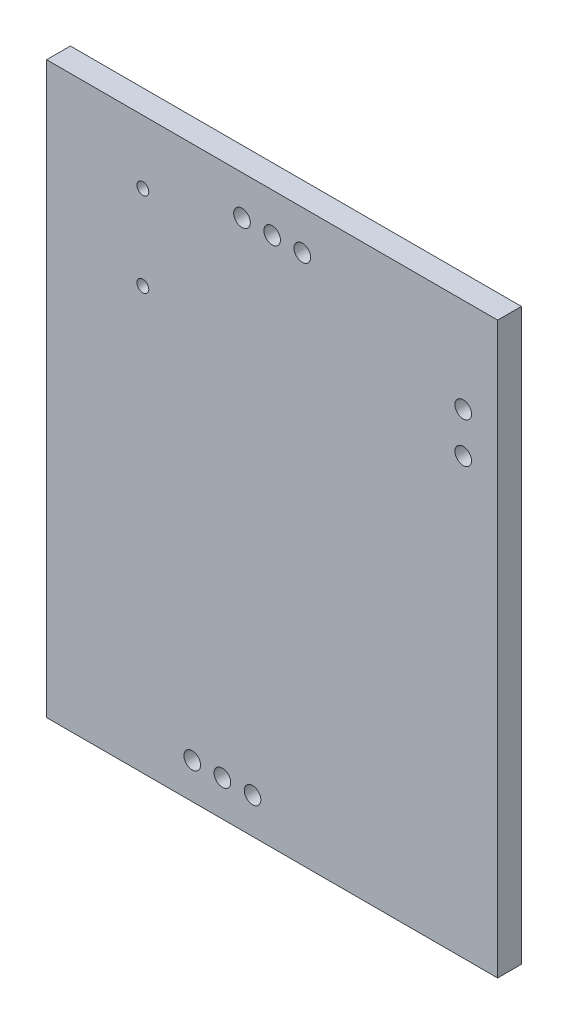
ISO-10303-21;
HEADER;
FILE_DESCRIPTION(('STEP AP214'),'2;1');
FILE_NAME('part.step','',(''),(''),'','','');
FILE_SCHEMA(('AUTOMOTIVE_DESIGN { 1 0 10303 214 1 1 1 1 }'));
ENDSEC;
DATA;
#1=APPLICATION_CONTEXT('core data for automotive mechanical design processes');
#2=APPLICATION_PROTOCOL_DEFINITION('international standard','automotive_design',2000,#1);
#3=PRODUCT_CONTEXT('',#1,'mechanical');
#4=PRODUCT('Part','Part','',(#3));
#5=PRODUCT_RELATED_PRODUCT_CATEGORY('part','',(#4));
#6=PRODUCT_DEFINITION_FORMATION('','',#4);
#7=PRODUCT_DEFINITION_CONTEXT('part definition',#1,'design');
#8=PRODUCT_DEFINITION('design','',#6,#7);
#9=PRODUCT_DEFINITION_SHAPE('','',#8);
#10=(LENGTH_UNIT() NAMED_UNIT(*) SI_UNIT(.MILLI.,.METRE.));
#11=(NAMED_UNIT(*) PLANE_ANGLE_UNIT() SI_UNIT($,.RADIAN.));
#12=(NAMED_UNIT(*) SI_UNIT($,.STERADIAN.) SOLID_ANGLE_UNIT());
#13=UNCERTAINTY_MEASURE_WITH_UNIT(LENGTH_MEASURE(1.E-05),#10,'distance_accuracy_value','');
#14=(GEOMETRIC_REPRESENTATION_CONTEXT(3) GLOBAL_UNCERTAINTY_ASSIGNED_CONTEXT((#13)) GLOBAL_UNIT_ASSIGNED_CONTEXT((#10,
#11,#12)) REPRESENTATION_CONTEXT('',''));
#15=CARTESIAN_POINT('',(0.,0.,0.));
#16=DIRECTION('',(0.,0.,1.));
#17=DIRECTION('',(1.,0.,0.));
#18=AXIS2_PLACEMENT_3D('',#15,#16,#17);
#19=CARTESIAN_POINT('',(19.668039116078,-21.2632029464,1.000001778004));
#20=DIRECTION('',(0.,0.,-1.));
#21=DIRECTION('',(-1.,0.,0.));
#22=AXIS2_PLACEMENT_3D('',#19,#20,#21);
#23=PLANE('',#22);
#24=CARTESIAN_POINT('',(27.714503429007,-14.94716789433,1.000001778004));
#25=DIRECTION('',(0.,0.,-1.));
#26=DIRECTION('',(-1.,0.,0.));
#27=AXIS2_PLACEMENT_3D('',#24,#25,#26);
#28=CIRCLE('',#27,0.350012700025);
#29=CARTESIAN_POINT('',(27.364490728982,-14.94716789433,1.000001778004));
#30=VERTEX_POINT('',#29);
#31=EDGE_CURVE('E108',#30,#30,#28,.T.);
#32=ORIENTED_EDGE('',*,*,#31,.T.);
#33=EDGE_LOOP('',(#32));
#34=FACE_BOUND('',#33,.T.);
#35=CARTESIAN_POINT('',(27.714503429007,-13.24714249428,1.000001778004));
#36=DIRECTION('',(0.,0.,-1.));
#37=DIRECTION('',(-1.,0.,0.));
#38=AXIS2_PLACEMENT_3D('',#35,#36,#37);
#39=CIRCLE('',#38,0.350012700025);
#40=CARTESIAN_POINT('',(27.364490728982,-13.24714249428,1.000001778004));
#41=VERTEX_POINT('',#40);
#42=EDGE_CURVE('E112',#41,#41,#39,.T.);
#43=ORIENTED_EDGE('',*,*,#42,.T.);
#44=EDGE_LOOP('',(#43));
#45=FACE_BOUND('',#44,.T.);
#46=CARTESIAN_POINT('',(20.939057658115,-10.92202184404,1.000001778004));
#47=DIRECTION('',(0.,0.,-1.));
#48=DIRECTION('',(-1.,0.,0.));
#49=AXIS2_PLACEMENT_3D('',#46,#47,#48);
#50=CIRCLE('',#49,0.350012700025);
#51=CARTESIAN_POINT('',(20.58904495809,-10.92202184404,1.000001778004));
#52=VERTEX_POINT('',#51);
#53=EDGE_CURVE('E115',#52,#52,#50,.T.);
#54=ORIENTED_EDGE('',*,*,#53,.T.);
#55=EDGE_LOOP('',(#54));
#56=FACE_BOUND('',#55,.T.);
#57=CARTESIAN_POINT('',(19.66905511811,-10.92202184404,1.000001778004));
#58=DIRECTION('',(0.,0.,-1.));
#59=DIRECTION('',(-1.,0.,0.));
#60=AXIS2_PLACEMENT_3D('',#57,#58,#59);
#61=CIRCLE('',#60,0.350012700025);
#62=CARTESIAN_POINT('',(19.319042418085,-10.92202184404,1.000001778004));
#63=VERTEX_POINT('',#62);
#64=EDGE_CURVE('E118',#63,#63,#61,.T.);
#65=ORIENTED_EDGE('',*,*,#64,.T.);
#66=EDGE_LOOP('',(#65));
#67=FACE_BOUND('',#66,.T.);
#68=CARTESIAN_POINT('',(18.844297688595,-31.75006350012,1.000001778004));
#69=DIRECTION('',(0.,0.,-1.));
#70=DIRECTION('',(-1.,0.,0.));
#71=AXIS2_PLACEMENT_3D('',#68,#69,#70);
#72=CIRCLE('',#71,0.350012700025);
#73=CARTESIAN_POINT('',(18.49428498857,-31.75006350012,1.000001778004));
#74=VERTEX_POINT('',#73);
#75=EDGE_CURVE('E121',#74,#74,#72,.T.);
#76=ORIENTED_EDGE('',*,*,#75,.T.);
#77=EDGE_LOOP('',(#76));
#78=FACE_BOUND('',#77,.T.);
#79=CARTESIAN_POINT('',(18.399052578105,-10.92202184404,1.000001778004));
#80=DIRECTION('',(0.,0.,-1.));
#81=DIRECTION('',(-1.,0.,0.));
#82=AXIS2_PLACEMENT_3D('',#79,#80,#81);
#83=CIRCLE('',#82,0.350012700025);
#84=CARTESIAN_POINT('',(18.04903987808,-10.92202184404,1.000001778004));
#85=VERTEX_POINT('',#84);
#86=EDGE_CURVE('E124',#85,#85,#83,.T.);
#87=ORIENTED_EDGE('',*,*,#86,.T.);
#88=EDGE_LOOP('',(#87));
#89=FACE_BOUND('',#88,.T.);
#90=CARTESIAN_POINT('',(17.57429514859,-31.75006350012,1.000001778004));
#91=DIRECTION('',(0.,0.,-1.));
#92=DIRECTION('',(-1.,0.,0.));
#93=AXIS2_PLACEMENT_3D('',#90,#91,#92);
#94=CIRCLE('',#93,0.350012700025);
#95=CARTESIAN_POINT('',(17.224282448565,-31.75006350012,1.000001778004));
#96=VERTEX_POINT('',#95);
#97=EDGE_CURVE('E127',#96,#96,#94,.T.);
#98=ORIENTED_EDGE('',*,*,#97,.T.);
#99=EDGE_LOOP('',(#98));
#100=FACE_BOUND('',#99,.T.);
#101=CARTESIAN_POINT('',(16.304292608585,-31.75006350012,1.000001778004));
#102=DIRECTION('',(0.,0.,-1.));
#103=DIRECTION('',(-1.,0.,0.));
#104=AXIS2_PLACEMENT_3D('',#101,#102,#103);
#105=CIRCLE('',#104,0.350012700025);
#106=CARTESIAN_POINT('',(15.95427990856,-31.75006350012,1.000001778004));
#107=VERTEX_POINT('',#106);
#108=EDGE_CURVE('E130',#107,#107,#105,.T.);
#109=ORIENTED_EDGE('',*,*,#108,.T.);
#110=EDGE_LOOP('',(#109));
#111=FACE_BOUND('',#110,.T.);
#112=CARTESIAN_POINT('',(14.224028448057,-15.49403098806,1.000001778004));
#113=DIRECTION('',(0.,0.,-1.));
#114=DIRECTION('',(-1.,0.,0.));
#115=AXIS2_PLACEMENT_3D('',#112,#113,#114);
#116=CIRCLE('',#115,0.25);
#117=CARTESIAN_POINT('',(13.974028448057,-15.49403098806,1.000001778004));
#118=VERTEX_POINT('',#117);
#119=EDGE_CURVE('E132',#118,#118,#116,.T.);
#120=ORIENTED_EDGE('',*,*,#119,.T.);
#121=EDGE_LOOP('',(#120));
#122=FACE_BOUND('',#121,.T.);
#123=CARTESIAN_POINT('',(14.224028448057,-11.93802387604,1.000001778004));
#124=DIRECTION('',(0.,0.,-1.));
#125=DIRECTION('',(-1.,0.,0.));
#126=AXIS2_PLACEMENT_3D('',#123,#124,#125);
#127=CIRCLE('',#126,0.25);
#128=CARTESIAN_POINT('',(13.974028448057,-11.93802387604,1.000001778004));
#129=VERTEX_POINT('',#128);
#130=EDGE_CURVE('E20',#129,#129,#127,.T.);
#131=ORIENTED_EDGE('',*,*,#130,.T.);
#132=EDGE_LOOP('',(#131));
#133=FACE_BOUND('',#132,.T.);
#134=DIRECTION('',(0.,1.,0.));
#135=VECTOR('',#134,1.);
#136=CARTESIAN_POINT('',(10.172720345441,-33.25836677673,1.000001778004));
#137=LINE('',#136,#135);
#138=CARTESIAN_POINT('',(10.172720345441,-33.25836677673,1.000001778004));
#139=VERTEX_POINT('',#138);
#140=CARTESIAN_POINT('',(10.172720345441,-9.268039116078,1.000001778004));
#141=VERTEX_POINT('',#140);
#142=EDGE_CURVE('E70',#139,#141,#137,.T.);
#143=ORIENTED_EDGE('',*,*,#142,.F.);
#144=DIRECTION('',(1.,0.,0.));
#145=VECTOR('',#144,1.);
#146=CARTESIAN_POINT('',(29.163357886716,-33.25836677673,1.000001778004));
#147=LINE('',#146,#145);
#148=CARTESIAN_POINT('',(29.163357886716,-33.25836677673,1.000001778004));
#149=VERTEX_POINT('',#148);
#150=EDGE_CURVE('E55',#149,#139,#147,.F.);
#151=ORIENTED_EDGE('',*,*,#150,.F.);
#152=DIRECTION('',(0.,1.,0.));
#153=VECTOR('',#152,1.);
#154=CARTESIAN_POINT('',(29.163357886716,-9.268039116078,1.000001778004));
#155=LINE('',#154,#153);
#156=CARTESIAN_POINT('',(29.163357886716,-9.268039116078,1.000001778004));
#157=VERTEX_POINT('',#156);
#158=EDGE_CURVE('E60',#157,#149,#155,.F.);
#159=ORIENTED_EDGE('',*,*,#158,.F.);
#160=DIRECTION('',(1.,0.,0.));
#161=VECTOR('',#160,1.);
#162=CARTESIAN_POINT('',(10.172720345441,-9.268039116078,1.000001778004));
#163=LINE('',#162,#161);
#164=EDGE_CURVE('E139',#141,#157,#163,.T.);
#165=ORIENTED_EDGE('',*,*,#164,.F.);
#166=EDGE_LOOP('',(#143,#151,#159,#165));
#167=FACE_BOUND('',#166,.T.);
#168=ADVANCED_FACE('F17',(#34,#45,#56,#67,#78,#89,#100,#111,#122,#133,#167),#23,.F.);
#169=CARTESIAN_POINT('',(29.163357886716,-9.268039116078,0.));
#170=DIRECTION('',(1.,0.,0.));
#171=DIRECTION('',(0.,0.,-1.));
#172=AXIS2_PLACEMENT_3D('',#169,#170,#171);
#173=PLANE('',#172);
#174=DIRECTION('',(0.,0.,-1.));
#175=VECTOR('',#174,1.);
#176=CARTESIAN_POINT('',(29.163357886716,-33.25836677673,0.));
#177=LINE('',#176,#175);
#178=CARTESIAN_POINT('',(29.163357886716,-33.25836677673,0.));
#179=VERTEX_POINT('',#178);
#180=EDGE_CURVE('E62',#179,#149,#177,.F.);
#181=ORIENTED_EDGE('',*,*,#180,.F.);
#182=DIRECTION('',(0.,1.,0.));
#183=VECTOR('',#182,1.);
#184=CARTESIAN_POINT('',(29.163357886716,-21.2632029464,0.));
#185=LINE('',#184,#183);
#186=CARTESIAN_POINT('',(29.163357886716,-9.268039116078,0.));
#187=VERTEX_POINT('',#186);
#188=EDGE_CURVE('E111',#187,#179,#185,.F.);
#189=ORIENTED_EDGE('',*,*,#188,.F.);
#190=DIRECTION('',(0.,0.,1.));
#191=VECTOR('',#190,1.);
#192=CARTESIAN_POINT('',(29.163357886716,-9.268039116078,0.));
#193=LINE('',#192,#191);
#194=EDGE_CURVE('E65',#157,#187,#193,.F.);
#195=ORIENTED_EDGE('',*,*,#194,.F.);
#196=ORIENTED_EDGE('',*,*,#158,.T.);
#197=EDGE_LOOP('',(#181,#189,#195,#196));
#198=FACE_BOUND('',#197,.T.);
#199=ADVANCED_FACE('F61',(#198),#173,.T.);
#200=CARTESIAN_POINT('',(29.163357886716,-33.25836677673,0.));
#201=DIRECTION('',(0.,-1.,0.));
#202=DIRECTION('',(0.,0.,-1.));
#203=AXIS2_PLACEMENT_3D('',#200,#201,#202);
#204=PLANE('',#203);
#205=DIRECTION('',(0.,0.,1.));
#206=VECTOR('',#205,1.);
#207=CARTESIAN_POINT('',(10.172720345441,-33.25836677673,0.));
#208=LINE('',#207,#206);
#209=CARTESIAN_POINT('',(10.172720345441,-33.25836677673,0.));
#210=VERTEX_POINT('',#209);
#211=EDGE_CURVE('E72',#210,#139,#208,.T.);
#212=ORIENTED_EDGE('',*,*,#211,.F.);
#213=DIRECTION('',(-1.,0.,0.));
#214=VECTOR('',#213,1.);
#215=CARTESIAN_POINT('',(19.668039116078,-33.25836677673,0.));
#216=LINE('',#215,#214);
#217=EDGE_CURVE('E76',#179,#210,#216,.T.);
#218=ORIENTED_EDGE('',*,*,#217,.F.);
#219=ORIENTED_EDGE('',*,*,#180,.T.);
#220=ORIENTED_EDGE('',*,*,#150,.T.);
#221=EDGE_LOOP('',(#212,#218,#219,#220));
#222=FACE_BOUND('',#221,.T.);
#223=ADVANCED_FACE('F74',(#222),#204,.T.);
#224=CARTESIAN_POINT('',(10.172720345441,-33.25836677673,0.));
#225=DIRECTION('',(-1.,0.,0.));
#226=DIRECTION('',(0.,0.,1.));
#227=AXIS2_PLACEMENT_3D('',#224,#225,#226);
#228=PLANE('',#227);
#229=DIRECTION('',(0.,0.,1.));
#230=VECTOR('',#229,1.);
#231=CARTESIAN_POINT('',(10.172720345441,-9.268039116078,0.));
#232=LINE('',#231,#230);
#233=CARTESIAN_POINT('',(10.172720345441,-9.268039116078,0.));
#234=VERTEX_POINT('',#233);
#235=EDGE_CURVE('E35',#234,#141,#232,.T.);
#236=ORIENTED_EDGE('',*,*,#235,.F.);
#237=DIRECTION('',(0.,1.,0.));
#238=VECTOR('',#237,1.);
#239=CARTESIAN_POINT('',(10.172720345441,-21.2632029464,0.));
#240=LINE('',#239,#238);
#241=EDGE_CURVE('E150',#210,#234,#240,.T.);
#242=ORIENTED_EDGE('',*,*,#241,.F.);
#243=ORIENTED_EDGE('',*,*,#211,.T.);
#244=ORIENTED_EDGE('',*,*,#142,.T.);
#245=EDGE_LOOP('',(#236,#242,#243,#244));
#246=FACE_BOUND('',#245,.T.);
#247=ADVANCED_FACE('F148',(#246),#228,.T.);
#248=CARTESIAN_POINT('',(10.172720345441,-9.268039116078,0.));
#249=DIRECTION('',(0.,1.,0.));
#250=DIRECTION('',(0.,0.,1.));
#251=AXIS2_PLACEMENT_3D('',#248,#249,#250);
#252=PLANE('',#251);
#253=ORIENTED_EDGE('',*,*,#194,.T.);
#254=DIRECTION('',(-1.,0.,0.));
#255=VECTOR('',#254,1.);
#256=CARTESIAN_POINT('',(19.668039116078,-9.268039116078,0.));
#257=LINE('',#256,#255);
#258=EDGE_CURVE('E107',#234,#187,#257,.F.);
#259=ORIENTED_EDGE('',*,*,#258,.F.);
#260=ORIENTED_EDGE('',*,*,#235,.T.);
#261=ORIENTED_EDGE('',*,*,#164,.T.);
#262=EDGE_LOOP('',(#253,#259,#260,#261));
#263=FACE_BOUND('',#262,.T.);
#264=ADVANCED_FACE('F155',(#263),#252,.T.);
#265=CARTESIAN_POINT('',(14.224028448057,-11.93802387604,0.));
#266=DIRECTION('',(0.,0.,-1.));
#267=DIRECTION('',(-1.,0.,0.));
#268=AXIS2_PLACEMENT_3D('',#265,#266,#267);
#269=CYLINDRICAL_SURFACE('',#268,0.25);
#270=ORIENTED_EDGE('',*,*,#130,.F.);
#271=EDGE_LOOP('',(#270));
#272=FACE_BOUND('',#271,.T.);
#273=CARTESIAN_POINT('',(14.224028448057,-11.93802387604,0.));
#274=DIRECTION('',(0.,0.,-1.));
#275=DIRECTION('',(-1.,0.,0.));
#276=AXIS2_PLACEMENT_3D('',#273,#274,#275);
#277=CIRCLE('',#276,0.25);
#278=CARTESIAN_POINT('',(13.974028448057,-11.93802387604,0.));
#279=VERTEX_POINT('',#278);
#280=EDGE_CURVE('E104',#279,#279,#277,.F.);
#281=ORIENTED_EDGE('',*,*,#280,.F.);
#282=EDGE_LOOP('',(#281));
#283=FACE_BOUND('',#282,.T.);
#284=ADVANCED_FACE('F157',(#272,#283),#269,.F.);
#285=CARTESIAN_POINT('',(14.224028448057,-15.49403098806,0.));
#286=DIRECTION('',(0.,0.,-1.));
#287=DIRECTION('',(-1.,0.,0.));
#288=AXIS2_PLACEMENT_3D('',#285,#286,#287);
#289=CYLINDRICAL_SURFACE('',#288,0.25);
#290=ORIENTED_EDGE('',*,*,#119,.F.);
#291=EDGE_LOOP('',(#290));
#292=FACE_BOUND('',#291,.T.);
#293=CARTESIAN_POINT('',(14.224028448057,-15.49403098806,0.));
#294=DIRECTION('',(0.,0.,-1.));
#295=DIRECTION('',(-1.,0.,0.));
#296=AXIS2_PLACEMENT_3D('',#293,#294,#295);
#297=CIRCLE('',#296,0.25);
#298=CARTESIAN_POINT('',(13.974028448057,-15.49403098806,0.));
#299=VERTEX_POINT('',#298);
#300=EDGE_CURVE('E101',#299,#299,#297,.F.);
#301=ORIENTED_EDGE('',*,*,#300,.F.);
#302=EDGE_LOOP('',(#301));
#303=FACE_BOUND('',#302,.T.);
#304=ADVANCED_FACE('F164',(#292,#303),#289,.F.);
#305=CARTESIAN_POINT('',(16.304292608585,-31.75006350012,0.));
#306=DIRECTION('',(0.,0.,-1.));
#307=DIRECTION('',(-1.,0.,0.));
#308=AXIS2_PLACEMENT_3D('',#305,#306,#307);
#309=CYLINDRICAL_SURFACE('',#308,0.350012700025);
#310=ORIENTED_EDGE('',*,*,#108,.F.);
#311=EDGE_LOOP('',(#310));
#312=FACE_BOUND('',#311,.T.);
#313=CARTESIAN_POINT('',(16.304292608585,-31.75006350012,0.));
#314=DIRECTION('',(0.,0.,-1.));
#315=DIRECTION('',(-1.,0.,0.));
#316=AXIS2_PLACEMENT_3D('',#313,#314,#315);
#317=CIRCLE('',#316,0.350012700025);
#318=CARTESIAN_POINT('',(15.95427990856,-31.75006350012,0.));
#319=VERTEX_POINT('',#318);
#320=EDGE_CURVE('E98',#319,#319,#317,.F.);
#321=ORIENTED_EDGE('',*,*,#320,.F.);
#322=EDGE_LOOP('',(#321));
#323=FACE_BOUND('',#322,.T.);
#324=ADVANCED_FACE('F202',(#312,#323),#309,.F.);
#325=CARTESIAN_POINT('',(17.57429514859,-31.75006350012,0.));
#326=DIRECTION('',(0.,0.,-1.));
#327=DIRECTION('',(-1.,0.,0.));
#328=AXIS2_PLACEMENT_3D('',#325,#326,#327);
#329=CYLINDRICAL_SURFACE('',#328,0.350012700025);
#330=ORIENTED_EDGE('',*,*,#97,.F.);
#331=EDGE_LOOP('',(#330));
#332=FACE_BOUND('',#331,.T.);
#333=CARTESIAN_POINT('',(17.57429514859,-31.75006350012,0.));
#334=DIRECTION('',(0.,0.,-1.));
#335=DIRECTION('',(-1.,0.,0.));
#336=AXIS2_PLACEMENT_3D('',#333,#334,#335);
#337=CIRCLE('',#336,0.350012700025);
#338=CARTESIAN_POINT('',(17.224282448565,-31.75006350012,0.));
#339=VERTEX_POINT('',#338);
#340=EDGE_CURVE('E95',#339,#339,#337,.F.);
#341=ORIENTED_EDGE('',*,*,#340,.F.);
#342=EDGE_LOOP('',(#341));
#343=FACE_BOUND('',#342,.T.);
#344=ADVANCED_FACE('F198',(#332,#343),#329,.F.);
#345=CARTESIAN_POINT('',(18.399052578105,-10.92202184404,0.));
#346=DIRECTION('',(0.,0.,-1.));
#347=DIRECTION('',(-1.,0.,0.));
#348=AXIS2_PLACEMENT_3D('',#345,#346,#347);
#349=CYLINDRICAL_SURFACE('',#348,0.350012700025);
#350=ORIENTED_EDGE('',*,*,#86,.F.);
#351=EDGE_LOOP('',(#350));
#352=FACE_BOUND('',#351,.T.);
#353=CARTESIAN_POINT('',(18.399052578105,-10.92202184404,0.));
#354=DIRECTION('',(0.,0.,-1.));
#355=DIRECTION('',(-1.,0.,0.));
#356=AXIS2_PLACEMENT_3D('',#353,#354,#355);
#357=CIRCLE('',#356,0.350012700025);
#358=CARTESIAN_POINT('',(18.04903987808,-10.92202184404,0.));
#359=VERTEX_POINT('',#358);
#360=EDGE_CURVE('E92',#359,#359,#357,.F.);
#361=ORIENTED_EDGE('',*,*,#360,.F.);
#362=EDGE_LOOP('',(#361));
#363=FACE_BOUND('',#362,.T.);
#364=ADVANCED_FACE('F194',(#352,#363),#349,.F.);
#365=CARTESIAN_POINT('',(18.844297688595,-31.75006350012,0.));
#366=DIRECTION('',(0.,0.,-1.));
#367=DIRECTION('',(-1.,0.,0.));
#368=AXIS2_PLACEMENT_3D('',#365,#366,#367);
#369=CYLINDRICAL_SURFACE('',#368,0.350012700025);
#370=ORIENTED_EDGE('',*,*,#75,.F.);
#371=EDGE_LOOP('',(#370));
#372=FACE_BOUND('',#371,.T.);
#373=CARTESIAN_POINT('',(18.844297688595,-31.75006350012,0.));
#374=DIRECTION('',(0.,0.,-1.));
#375=DIRECTION('',(-1.,0.,0.));
#376=AXIS2_PLACEMENT_3D('',#373,#374,#375);
#377=CIRCLE('',#376,0.350012700025);
#378=CARTESIAN_POINT('',(18.49428498857,-31.75006350012,0.));
#379=VERTEX_POINT('',#378);
#380=EDGE_CURVE('E89',#379,#379,#377,.F.);
#381=ORIENTED_EDGE('',*,*,#380,.F.);
#382=EDGE_LOOP('',(#381));
#383=FACE_BOUND('',#382,.T.);
#384=ADVANCED_FACE('F190',(#372,#383),#369,.F.);
#385=CARTESIAN_POINT('',(19.66905511811,-10.92202184404,0.));
#386=DIRECTION('',(0.,0.,-1.));
#387=DIRECTION('',(-1.,0.,0.));
#388=AXIS2_PLACEMENT_3D('',#385,#386,#387);
#389=CYLINDRICAL_SURFACE('',#388,0.350012700025);
#390=ORIENTED_EDGE('',*,*,#64,.F.);
#391=EDGE_LOOP('',(#390));
#392=FACE_BOUND('',#391,.T.);
#393=CARTESIAN_POINT('',(19.66905511811,-10.92202184404,0.));
#394=DIRECTION('',(0.,0.,-1.));
#395=DIRECTION('',(-1.,0.,0.));
#396=AXIS2_PLACEMENT_3D('',#393,#394,#395);
#397=CIRCLE('',#396,0.350012700025);
#398=CARTESIAN_POINT('',(19.319042418085,-10.92202184404,0.));
#399=VERTEX_POINT('',#398);
#400=EDGE_CURVE('E86',#399,#399,#397,.F.);
#401=ORIENTED_EDGE('',*,*,#400,.F.);
#402=EDGE_LOOP('',(#401));
#403=FACE_BOUND('',#402,.T.);
#404=ADVANCED_FACE('F186',(#392,#403),#389,.F.);
#405=CARTESIAN_POINT('',(20.939057658115,-10.92202184404,0.));
#406=DIRECTION('',(0.,0.,-1.));
#407=DIRECTION('',(-1.,0.,0.));
#408=AXIS2_PLACEMENT_3D('',#405,#406,#407);
#409=CYLINDRICAL_SURFACE('',#408,0.350012700025);
#410=ORIENTED_EDGE('',*,*,#53,.F.);
#411=EDGE_LOOP('',(#410));
#412=FACE_BOUND('',#411,.T.);
#413=CARTESIAN_POINT('',(20.939057658115,-10.92202184404,0.));
#414=DIRECTION('',(0.,0.,-1.));
#415=DIRECTION('',(-1.,0.,0.));
#416=AXIS2_PLACEMENT_3D('',#413,#414,#415);
#417=CIRCLE('',#416,0.350012700025);
#418=CARTESIAN_POINT('',(20.58904495809,-10.92202184404,0.));
#419=VERTEX_POINT('',#418);
#420=EDGE_CURVE('E83',#419,#419,#417,.F.);
#421=ORIENTED_EDGE('',*,*,#420,.F.);
#422=EDGE_LOOP('',(#421));
#423=FACE_BOUND('',#422,.T.);
#424=ADVANCED_FACE('F182',(#412,#423),#409,.F.);
#425=CARTESIAN_POINT('',(27.714503429007,-13.24714249428,0.));
#426=DIRECTION('',(0.,0.,-1.));
#427=DIRECTION('',(-1.,0.,0.));
#428=AXIS2_PLACEMENT_3D('',#425,#426,#427);
#429=CYLINDRICAL_SURFACE('',#428,0.350012700025);
#430=ORIENTED_EDGE('',*,*,#42,.F.);
#431=EDGE_LOOP('',(#430));
#432=FACE_BOUND('',#431,.T.);
#433=CARTESIAN_POINT('',(27.714503429007,-13.24714249428,0.));
#434=DIRECTION('',(0.,0.,-1.));
#435=DIRECTION('',(-1.,0.,0.));
#436=AXIS2_PLACEMENT_3D('',#433,#434,#435);
#437=CIRCLE('',#436,0.350012700025);
#438=CARTESIAN_POINT('',(27.364490728982,-13.24714249428,0.));
#439=VERTEX_POINT('',#438);
#440=EDGE_CURVE('E26',#439,#439,#437,.F.);
#441=ORIENTED_EDGE('',*,*,#440,.F.);
#442=EDGE_LOOP('',(#441));
#443=FACE_BOUND('',#442,.T.);
#444=ADVANCED_FACE('F175',(#432,#443),#429,.F.);
#445=CARTESIAN_POINT('',(27.714503429007,-14.94716789433,0.));
#446=DIRECTION('',(0.,0.,-1.));
#447=DIRECTION('',(-1.,0.,0.));
#448=AXIS2_PLACEMENT_3D('',#445,#446,#447);
#449=CYLINDRICAL_SURFACE('',#448,0.350012700025);
#450=ORIENTED_EDGE('',*,*,#31,.F.);
#451=EDGE_LOOP('',(#450));
#452=FACE_BOUND('',#451,.T.);
#453=CARTESIAN_POINT('',(27.714503429007,-14.94716789433,0.));
#454=DIRECTION('',(0.,0.,-1.));
#455=DIRECTION('',(-1.,0.,0.));
#456=AXIS2_PLACEMENT_3D('',#453,#454,#455);
#457=CIRCLE('',#456,0.350012700025);
#458=CARTESIAN_POINT('',(27.364490728982,-14.94716789433,0.));
#459=VERTEX_POINT('',#458);
#460=EDGE_CURVE('E11',#459,#459,#457,.F.);
#461=ORIENTED_EDGE('',*,*,#460,.F.);
#462=EDGE_LOOP('',(#461));
#463=FACE_BOUND('',#462,.T.);
#464=ADVANCED_FACE('F169',(#452,#463),#449,.F.);
#465=CARTESIAN_POINT('',(19.668039116078,-21.2632029464,0.));
#466=DIRECTION('',(0.,0.,-1.));
#467=DIRECTION('',(-1.,0.,0.));
#468=AXIS2_PLACEMENT_3D('',#465,#466,#467);
#469=PLANE('',#468);
#470=ORIENTED_EDGE('',*,*,#460,.T.);
#471=EDGE_LOOP('',(#470));
#472=FACE_BOUND('',#471,.T.);
#473=ORIENTED_EDGE('',*,*,#440,.T.);
#474=EDGE_LOOP('',(#473));
#475=FACE_BOUND('',#474,.T.);
#476=ORIENTED_EDGE('',*,*,#420,.T.);
#477=EDGE_LOOP('',(#476));
#478=FACE_BOUND('',#477,.T.);
#479=ORIENTED_EDGE('',*,*,#400,.T.);
#480=EDGE_LOOP('',(#479));
#481=FACE_BOUND('',#480,.T.);
#482=ORIENTED_EDGE('',*,*,#380,.T.);
#483=EDGE_LOOP('',(#482));
#484=FACE_BOUND('',#483,.T.);
#485=ORIENTED_EDGE('',*,*,#360,.T.);
#486=EDGE_LOOP('',(#485));
#487=FACE_BOUND('',#486,.T.);
#488=ORIENTED_EDGE('',*,*,#340,.T.);
#489=EDGE_LOOP('',(#488));
#490=FACE_BOUND('',#489,.T.);
#491=ORIENTED_EDGE('',*,*,#320,.T.);
#492=EDGE_LOOP('',(#491));
#493=FACE_BOUND('',#492,.T.);
#494=ORIENTED_EDGE('',*,*,#300,.T.);
#495=EDGE_LOOP('',(#494));
#496=FACE_BOUND('',#495,.T.);
#497=ORIENTED_EDGE('',*,*,#280,.T.);
#498=EDGE_LOOP('',(#497));
#499=FACE_BOUND('',#498,.T.);
#500=ORIENTED_EDGE('',*,*,#241,.T.);
#501=ORIENTED_EDGE('',*,*,#258,.T.);
#502=ORIENTED_EDGE('',*,*,#188,.T.);
#503=ORIENTED_EDGE('',*,*,#217,.T.);
#504=EDGE_LOOP('',(#500,#501,#502,#503));
#505=FACE_BOUND('',#504,.T.);
#506=ADVANCED_FACE('F153',(#472,#475,#478,#481,#484,#487,#490,#493,#496,#499,#505),#469,.T.);
#507=CLOSED_SHELL('',(#168,#199,#223,#247,#264,#284,#304,#324,#344,#364,#384,#404,#424,#444,
#464,#506));
#508=MANIFOLD_SOLID_BREP('B1',#507);
#509=ADVANCED_BREP_SHAPE_REPRESENTATION('',(#18,#508),#14);
#510=SHAPE_DEFINITION_REPRESENTATION(#9,#509);
ENDSEC;
END-ISO-10303-21;
